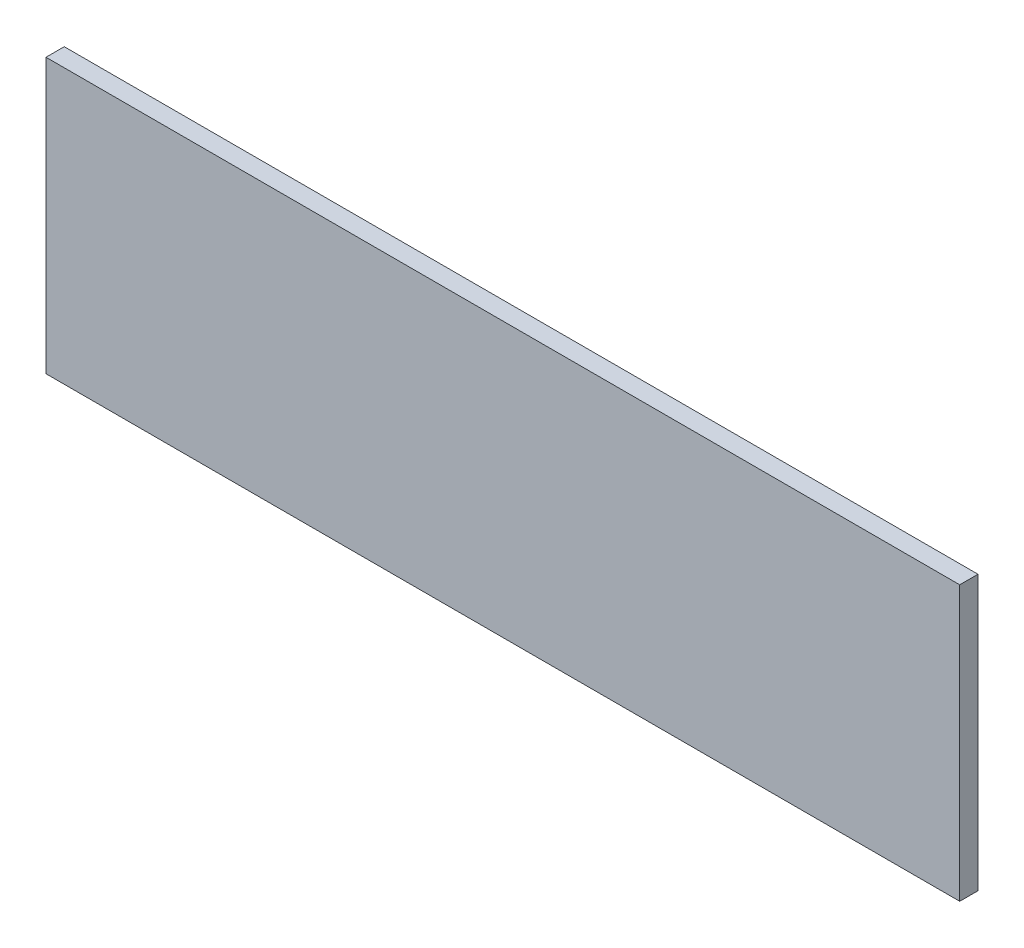
ISO-10303-21;
HEADER;
FILE_DESCRIPTION(('STEP AP214'),'2;1');
FILE_NAME('part.step','',(''),(''),'','','');
FILE_SCHEMA(('AUTOMOTIVE_DESIGN { 1 0 10303 214 1 1 1 1 }'));
ENDSEC;
DATA;
#1=APPLICATION_CONTEXT('core data for automotive mechanical design processes');
#2=APPLICATION_PROTOCOL_DEFINITION('international standard','automotive_design',2000,#1);
#3=PRODUCT_CONTEXT('',#1,'mechanical');
#4=PRODUCT('Part','Part','',(#3));
#5=PRODUCT_RELATED_PRODUCT_CATEGORY('part','',(#4));
#6=PRODUCT_DEFINITION_FORMATION('','',#4);
#7=PRODUCT_DEFINITION_CONTEXT('part definition',#1,'design');
#8=PRODUCT_DEFINITION('design','',#6,#7);
#9=PRODUCT_DEFINITION_SHAPE('','',#8);
#10=(LENGTH_UNIT() NAMED_UNIT(*) SI_UNIT(.MILLI.,.METRE.));
#11=(NAMED_UNIT(*) PLANE_ANGLE_UNIT() SI_UNIT($,.RADIAN.));
#12=(NAMED_UNIT(*) SI_UNIT($,.STERADIAN.) SOLID_ANGLE_UNIT());
#13=UNCERTAINTY_MEASURE_WITH_UNIT(LENGTH_MEASURE(1.E-05),#10,'distance_accuracy_value','');
#14=(GEOMETRIC_REPRESENTATION_CONTEXT(3) GLOBAL_UNCERTAINTY_ASSIGNED_CONTEXT((#13)) GLOBAL_UNIT_ASSIGNED_CONTEXT((#10,
#11,#12)) REPRESENTATION_CONTEXT('',''));
#15=CARTESIAN_POINT('',(0.,0.,0.));
#16=DIRECTION('',(0.,0.,1.));
#17=DIRECTION('',(1.,0.,0.));
#18=AXIS2_PLACEMENT_3D('',#15,#16,#17);
#19=CARTESIAN_POINT('',(1.35346358792186,24.2721136767318,2.54));
#20=DIRECTION('',(-1.,0.,0.));
#21=DIRECTION('',(0.,0.,1.));
#22=AXIS2_PLACEMENT_3D('',#19,#20,#21);
#23=PLANE('',#22);
#24=DIRECTION('',(0.,1.,0.));
#25=VECTOR('',#24,1.);
#26=CARTESIAN_POINT('',(1.35346358792186,24.2721136767318,0.));
#27=LINE('',#26,#25);
#28=CARTESIAN_POINT('',(1.35346358792186,24.2721136767318,0.));
#29=VERTEX_POINT('',#28);
#30=CARTESIAN_POINT('',(1.35346358792186,62.3721136767318,0.));
#31=VERTEX_POINT('',#30);
#32=EDGE_CURVE('E96',#29,#31,#27,.T.);
#33=ORIENTED_EDGE('',*,*,#32,.T.);
#34=DIRECTION('',(0.,0.,-1.));
#35=VECTOR('',#34,1.);
#36=CARTESIAN_POINT('',(1.35346358792186,62.3721136767318,2.54));
#37=LINE('',#36,#35);
#38=CARTESIAN_POINT('',(1.35346358792186,62.3721136767318,2.54));
#39=VERTEX_POINT('',#38);
#40=EDGE_CURVE('E11',#39,#31,#37,.T.);
#41=ORIENTED_EDGE('',*,*,#40,.F.);
#42=DIRECTION('',(0.,1.,0.));
#43=VECTOR('',#42,1.);
#44=CARTESIAN_POINT('',(1.35346358792186,24.2721136767318,2.54));
#45=LINE('',#44,#43);
#46=CARTESIAN_POINT('',(1.35346358792186,24.2721136767318,2.54));
#47=VERTEX_POINT('',#46);
#48=EDGE_CURVE('E84',#47,#39,#45,.T.);
#49=ORIENTED_EDGE('',*,*,#48,.F.);
#50=DIRECTION('',(0.,0.,-1.));
#51=VECTOR('',#50,1.);
#52=CARTESIAN_POINT('',(1.35346358792186,24.2721136767318,2.54));
#53=LINE('',#52,#51);
#54=EDGE_CURVE('E92',#47,#29,#53,.T.);
#55=ORIENTED_EDGE('',*,*,#54,.T.);
#56=EDGE_LOOP('',(#33,#41,#49,#55));
#57=FACE_BOUND('',#56,.T.);
#58=ADVANCED_FACE('F33',(#57),#23,.F.);
#59=CARTESIAN_POINT('',(1.35346358792186,62.3721136767318,2.54));
#60=DIRECTION('',(0.,-1.,0.));
#61=DIRECTION('',(0.,0.,-1.));
#62=AXIS2_PLACEMENT_3D('',#59,#60,#61);
#63=PLANE('',#62);
#64=DIRECTION('',(-1.,0.,0.));
#65=VECTOR('',#64,1.);
#66=CARTESIAN_POINT('',(1.35346358792186,62.3721136767318,0.));
#67=LINE('',#66,#65);
#68=CARTESIAN_POINT('',(-125.646536412078,62.3721136767318,0.));
#69=VERTEX_POINT('',#68);
#70=EDGE_CURVE('E88',#31,#69,#67,.T.);
#71=ORIENTED_EDGE('',*,*,#70,.T.);
#72=DIRECTION('',(0.,0.,-1.));
#73=VECTOR('',#72,1.);
#74=CARTESIAN_POINT('',(-125.646536412078,62.3721136767318,2.54));
#75=LINE('',#74,#73);
#76=CARTESIAN_POINT('',(-125.646536412078,62.3721136767318,2.54));
#77=VERTEX_POINT('',#76);
#78=EDGE_CURVE('E41',#77,#69,#75,.T.);
#79=ORIENTED_EDGE('',*,*,#78,.F.);
#80=DIRECTION('',(-1.,0.,0.));
#81=VECTOR('',#80,1.);
#82=CARTESIAN_POINT('',(1.35346358792186,62.3721136767318,2.54));
#83=LINE('',#82,#81);
#84=EDGE_CURVE('E79',#39,#77,#83,.T.);
#85=ORIENTED_EDGE('',*,*,#84,.F.);
#86=ORIENTED_EDGE('',*,*,#40,.T.);
#87=EDGE_LOOP('',(#71,#79,#85,#86));
#88=FACE_BOUND('',#87,.T.);
#89=ADVANCED_FACE('F87',(#88),#63,.F.);
#90=CARTESIAN_POINT('',(-125.646536412078,24.2721136767318,2.54));
#91=DIRECTION('',(1.,0.,0.));
#92=DIRECTION('',(0.,0.,-1.));
#93=AXIS2_PLACEMENT_3D('',#90,#91,#92);
#94=PLANE('',#93);
#95=DIRECTION('',(0.,-1.,0.));
#96=VECTOR('',#95,1.);
#97=CARTESIAN_POINT('',(-125.646536412078,24.2721136767318,0.));
#98=LINE('',#97,#96);
#99=CARTESIAN_POINT('',(-125.646536412078,24.2721136767318,0.));
#100=VERTEX_POINT('',#99);
#101=EDGE_CURVE('E66',#69,#100,#98,.T.);
#102=ORIENTED_EDGE('',*,*,#101,.T.);
#103=DIRECTION('',(0.,0.,-1.));
#104=VECTOR('',#103,1.);
#105=CARTESIAN_POINT('',(-125.646536412078,24.2721136767318,2.54));
#106=LINE('',#105,#104);
#107=CARTESIAN_POINT('',(-125.646536412078,24.2721136767318,2.54));
#108=VERTEX_POINT('',#107);
#109=EDGE_CURVE('E89',#108,#100,#106,.T.);
#110=ORIENTED_EDGE('',*,*,#109,.F.);
#111=DIRECTION('',(0.,-1.,0.));
#112=VECTOR('',#111,1.);
#113=CARTESIAN_POINT('',(-125.646536412078,24.2721136767318,2.54));
#114=LINE('',#113,#112);
#115=EDGE_CURVE('E82',#77,#108,#114,.T.);
#116=ORIENTED_EDGE('',*,*,#115,.F.);
#117=ORIENTED_EDGE('',*,*,#78,.T.);
#118=EDGE_LOOP('',(#102,#110,#116,#117));
#119=FACE_BOUND('',#118,.T.);
#120=ADVANCED_FACE('F90',(#119),#94,.F.);
#121=CARTESIAN_POINT('',(1.35346358792186,24.2721136767318,2.54));
#122=DIRECTION('',(0.,1.,0.));
#123=DIRECTION('',(-1.,0.,0.));
#124=AXIS2_PLACEMENT_3D('',#121,#122,#123);
#125=PLANE('',#124);
#126=DIRECTION('',(1.,0.,0.));
#127=VECTOR('',#126,1.);
#128=CARTESIAN_POINT('',(1.35346358792186,24.2721136767318,0.));
#129=LINE('',#128,#127);
#130=EDGE_CURVE('E72',#100,#29,#129,.T.);
#131=ORIENTED_EDGE('',*,*,#130,.T.);
#132=ORIENTED_EDGE('',*,*,#54,.F.);
#133=DIRECTION('',(1.,0.,0.));
#134=VECTOR('',#133,1.);
#135=CARTESIAN_POINT('',(1.35346358792186,24.2721136767318,2.54));
#136=LINE('',#135,#134);
#137=EDGE_CURVE('E49',#108,#47,#136,.T.);
#138=ORIENTED_EDGE('',*,*,#137,.F.);
#139=ORIENTED_EDGE('',*,*,#109,.T.);
#140=EDGE_LOOP('',(#131,#132,#138,#139));
#141=FACE_BOUND('',#140,.T.);
#142=ADVANCED_FACE('F103',(#141),#125,.F.);
#143=CARTESIAN_POINT('',(0.,0.,2.54));
#144=DIRECTION('',(0.,0.,1.));
#145=DIRECTION('',(1.,0.,0.));
#146=AXIS2_PLACEMENT_3D('',#143,#144,#145);
#147=PLANE('',#146);
#148=ORIENTED_EDGE('',*,*,#48,.T.);
#149=ORIENTED_EDGE('',*,*,#84,.T.);
#150=ORIENTED_EDGE('',*,*,#115,.T.);
#151=ORIENTED_EDGE('',*,*,#137,.T.);
#152=EDGE_LOOP('',(#148,#149,#150,#151));
#153=FACE_BOUND('',#152,.T.);
#154=ADVANCED_FACE('F80',(#153),#147,.T.);
#155=CARTESIAN_POINT('',(0.,0.,0.));
#156=DIRECTION('',(0.,0.,1.));
#157=DIRECTION('',(1.,0.,0.));
#158=AXIS2_PLACEMENT_3D('',#155,#156,#157);
#159=PLANE('',#158);
#160=ORIENTED_EDGE('',*,*,#32,.F.);
#161=ORIENTED_EDGE('',*,*,#130,.F.);
#162=ORIENTED_EDGE('',*,*,#101,.F.);
#163=ORIENTED_EDGE('',*,*,#70,.F.);
#164=EDGE_LOOP('',(#160,#161,#162,#163));
#165=FACE_BOUND('',#164,.T.);
#166=ADVANCED_FACE('F106',(#165),#159,.F.);
#167=CLOSED_SHELL('',(#58,#89,#120,#142,#154,#166));
#168=MANIFOLD_SOLID_BREP('B2',#167);
#169=ADVANCED_BREP_SHAPE_REPRESENTATION('',(#18,#168),#14);
#170=SHAPE_DEFINITION_REPRESENTATION(#9,#169);
ENDSEC;
END-ISO-10303-21;
